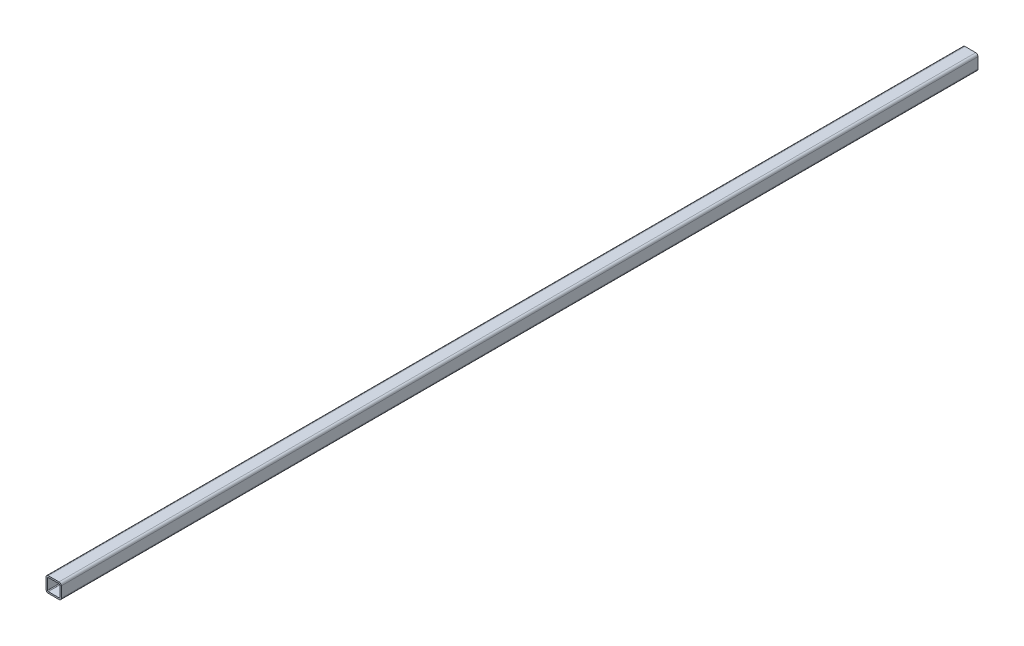
ISO-10303-21;
HEADER;
FILE_DESCRIPTION(('STEP AP214'),'2;1');
FILE_NAME('part.step','',(''),(''),'','','');
FILE_SCHEMA(('AUTOMOTIVE_DESIGN { 1 0 10303 214 1 1 1 1 }'));
ENDSEC;
DATA;
#1=APPLICATION_CONTEXT('core data for automotive mechanical design processes');
#2=APPLICATION_PROTOCOL_DEFINITION('international standard','automotive_design',2000,#1);
#3=PRODUCT_CONTEXT('',#1,'mechanical');
#4=PRODUCT('Part','Part','',(#3));
#5=PRODUCT_RELATED_PRODUCT_CATEGORY('part','',(#4));
#6=PRODUCT_DEFINITION_FORMATION('','',#4);
#7=PRODUCT_DEFINITION_CONTEXT('part definition',#1,'design');
#8=PRODUCT_DEFINITION('design','',#6,#7);
#9=PRODUCT_DEFINITION_SHAPE('','',#8);
#10=(LENGTH_UNIT() NAMED_UNIT(*) SI_UNIT(.MILLI.,.METRE.));
#11=(NAMED_UNIT(*) PLANE_ANGLE_UNIT() SI_UNIT($,.RADIAN.));
#12=(NAMED_UNIT(*) SI_UNIT($,.STERADIAN.) SOLID_ANGLE_UNIT());
#13=UNCERTAINTY_MEASURE_WITH_UNIT(LENGTH_MEASURE(1.E-05),#10,'distance_accuracy_value','');
#14=(GEOMETRIC_REPRESENTATION_CONTEXT(3) GLOBAL_UNCERTAINTY_ASSIGNED_CONTEXT((#13)) GLOBAL_UNIT_ASSIGNED_CONTEXT((#10,
#11,#12)) REPRESENTATION_CONTEXT('',''));
#15=CARTESIAN_POINT('',(0.,0.,0.));
#16=DIRECTION('',(0.,0.,1.));
#17=DIRECTION('',(1.,0.,0.));
#18=AXIS2_PLACEMENT_3D('',#15,#16,#17);
#19=CARTESIAN_POINT('',(12.75,-2.25000000000001,450.));
#20=DIRECTION('',(0.,0.,-1.));
#21=DIRECTION('',(-1.,0.,0.));
#22=AXIS2_PLACEMENT_3D('',#19,#20,#21);
#23=PLANE('',#22);
#24=CARTESIAN_POINT('',(12.75,-2.25000000000001,450.));
#25=DIRECTION('',(0.,0.,1.));
#26=DIRECTION('',(-1.,0.,0.));
#27=AXIS2_PLACEMENT_3D('',#24,#25,#26);
#28=CIRCLE('',#27,2.25);
#29=CARTESIAN_POINT('',(15.,-2.25000000000001,450.));
#30=VERTEX_POINT('',#29);
#31=CARTESIAN_POINT('',(12.75,0.,450.));
#32=VERTEX_POINT('',#31);
#33=EDGE_CURVE('E213',#30,#32,#28,.T.);
#34=ORIENTED_EDGE('',*,*,#33,.T.);
#35=DIRECTION('',(-1.,0.,0.));
#36=VECTOR('',#35,1.);
#37=CARTESIAN_POINT('',(2.24999999999996,0.,450.));
#38=LINE('',#37,#36);
#39=CARTESIAN_POINT('',(2.24999999999996,0.,450.));
#40=VERTEX_POINT('',#39);
#41=EDGE_CURVE('E216',#32,#40,#38,.T.);
#42=ORIENTED_EDGE('',*,*,#41,.T.);
#43=CARTESIAN_POINT('',(2.24999999999996,-2.25000000000001,450.));
#44=DIRECTION('',(0.,0.,1.));
#45=DIRECTION('',(-1.,0.,0.));
#46=AXIS2_PLACEMENT_3D('',#43,#44,#45);
#47=CIRCLE('',#46,2.25);
#48=CARTESIAN_POINT('',(0.,-2.25000000000001,450.));
#49=VERTEX_POINT('',#48);
#50=EDGE_CURVE('E219',#40,#49,#47,.T.);
#51=ORIENTED_EDGE('',*,*,#50,.T.);
#52=DIRECTION('',(0.,-1.,0.));
#53=VECTOR('',#52,1.);
#54=CARTESIAN_POINT('',(0.,-12.75,450.));
#55=LINE('',#54,#53);
#56=CARTESIAN_POINT('',(0.,-12.75,450.));
#57=VERTEX_POINT('',#56);
#58=EDGE_CURVE('E221',#49,#57,#55,.T.);
#59=ORIENTED_EDGE('',*,*,#58,.T.);
#60=CARTESIAN_POINT('',(2.24999999999996,-12.75,450.));
#61=DIRECTION('',(0.,0.,1.));
#62=DIRECTION('',(-1.,0.,0.));
#63=AXIS2_PLACEMENT_3D('',#60,#61,#62);
#64=CIRCLE('',#63,2.25);
#65=CARTESIAN_POINT('',(2.24999999999996,-15.,450.));
#66=VERTEX_POINT('',#65);
#67=EDGE_CURVE('E223',#57,#66,#64,.T.);
#68=ORIENTED_EDGE('',*,*,#67,.T.);
#69=DIRECTION('',(1.,0.,0.));
#70=VECTOR('',#69,1.);
#71=CARTESIAN_POINT('',(2.24999999999996,-15.,450.));
#72=LINE('',#71,#70);
#73=CARTESIAN_POINT('',(12.75,-15.,450.));
#74=VERTEX_POINT('',#73);
#75=EDGE_CURVE('E225',#66,#74,#72,.T.);
#76=ORIENTED_EDGE('',*,*,#75,.T.);
#77=CARTESIAN_POINT('',(12.75,-12.75,450.));
#78=DIRECTION('',(0.,0.,1.));
#79=DIRECTION('',(1.,0.,0.));
#80=AXIS2_PLACEMENT_3D('',#77,#78,#79);
#81=CIRCLE('',#80,2.25);
#82=CARTESIAN_POINT('',(15.,-12.75,450.));
#83=VERTEX_POINT('',#82);
#84=EDGE_CURVE('E227',#74,#83,#81,.T.);
#85=ORIENTED_EDGE('',*,*,#84,.T.);
#86=DIRECTION('',(0.,1.,0.));
#87=VECTOR('',#86,1.);
#88=CARTESIAN_POINT('',(15.,-12.75,450.));
#89=LINE('',#88,#87);
#90=EDGE_CURVE('E229',#83,#30,#89,.T.);
#91=ORIENTED_EDGE('',*,*,#90,.T.);
#92=EDGE_LOOP('',(#34,#42,#51,#59,#68,#76,#85,#91));
#93=FACE_BOUND('',#92,.T.);
#94=CARTESIAN_POINT('',(2.24999999999996,-12.75,450.));
#95=DIRECTION('',(0.,0.,1.));
#96=DIRECTION('',(-1.,0.,0.));
#97=AXIS2_PLACEMENT_3D('',#94,#95,#96);
#98=CIRCLE('',#97,0.75);
#99=CARTESIAN_POINT('',(1.49999999999996,-12.75,450.));
#100=VERTEX_POINT('',#99);
#101=CARTESIAN_POINT('',(2.24999999999996,-13.5,450.));
#102=VERTEX_POINT('',#101);
#103=EDGE_CURVE('E148',#100,#102,#98,.T.);
#104=ORIENTED_EDGE('',*,*,#103,.F.);
#105=DIRECTION('',(0.,-1.,0.));
#106=VECTOR('',#105,1.);
#107=CARTESIAN_POINT('',(1.49999999999996,-12.75,450.));
#108=LINE('',#107,#106);
#109=CARTESIAN_POINT('',(1.49999999999996,-2.25000000000002,450.));
#110=VERTEX_POINT('',#109);
#111=EDGE_CURVE('E181',#110,#100,#108,.T.);
#112=ORIENTED_EDGE('',*,*,#111,.F.);
#113=CARTESIAN_POINT('',(2.24999999999996,-2.25000000000002,450.));
#114=DIRECTION('',(0.,0.,1.));
#115=DIRECTION('',(-1.,0.,0.));
#116=AXIS2_PLACEMENT_3D('',#113,#114,#115);
#117=CIRCLE('',#116,0.749999999999999);
#118=CARTESIAN_POINT('',(2.24999999999996,-1.50000000000002,450.));
#119=VERTEX_POINT('',#118);
#120=EDGE_CURVE('E179',#119,#110,#117,.T.);
#121=ORIENTED_EDGE('',*,*,#120,.F.);
#122=DIRECTION('',(-1.,0.,0.));
#123=VECTOR('',#122,1.);
#124=CARTESIAN_POINT('',(2.24999999999996,-1.50000000000002,450.));
#125=LINE('',#124,#123);
#126=CARTESIAN_POINT('',(12.75,-1.50000000000002,450.));
#127=VERTEX_POINT('',#126);
#128=EDGE_CURVE('E177',#127,#119,#125,.T.);
#129=ORIENTED_EDGE('',*,*,#128,.F.);
#130=CARTESIAN_POINT('',(12.75,-2.25000000000002,450.));
#131=DIRECTION('',(0.,0.,1.));
#132=DIRECTION('',(-1.,0.,0.));
#133=AXIS2_PLACEMENT_3D('',#130,#131,#132);
#134=CIRCLE('',#133,0.749999999999999);
#135=CARTESIAN_POINT('',(13.5,-2.25000000000002,450.));
#136=VERTEX_POINT('',#135);
#137=EDGE_CURVE('E175',#136,#127,#134,.T.);
#138=ORIENTED_EDGE('',*,*,#137,.F.);
#139=DIRECTION('',(0.,1.,0.));
#140=VECTOR('',#139,1.);
#141=CARTESIAN_POINT('',(13.5,-12.75,450.));
#142=LINE('',#141,#140);
#143=CARTESIAN_POINT('',(13.5,-12.75,450.));
#144=VERTEX_POINT('',#143);
#145=EDGE_CURVE('E171',#144,#136,#142,.T.);
#146=ORIENTED_EDGE('',*,*,#145,.F.);
#147=CARTESIAN_POINT('',(12.75,-12.75,450.));
#148=DIRECTION('',(0.,0.,1.));
#149=DIRECTION('',(1.,0.,0.));
#150=AXIS2_PLACEMENT_3D('',#147,#148,#149);
#151=CIRCLE('',#150,0.75);
#152=CARTESIAN_POINT('',(12.75,-13.5,450.));
#153=VERTEX_POINT('',#152);
#154=EDGE_CURVE('E169',#153,#144,#151,.T.);
#155=ORIENTED_EDGE('',*,*,#154,.F.);
#156=DIRECTION('',(1.,0.,0.));
#157=VECTOR('',#156,1.);
#158=CARTESIAN_POINT('',(2.24999999999996,-13.5,450.));
#159=LINE('',#158,#157);
#160=EDGE_CURVE('E156',#102,#153,#159,.T.);
#161=ORIENTED_EDGE('',*,*,#160,.F.);
#162=EDGE_LOOP('',(#104,#112,#121,#129,#138,#146,#155,#161));
#163=FACE_BOUND('',#162,.T.);
#164=ADVANCED_FACE('F35',(#93,#163),#23,.F.);
#165=CARTESIAN_POINT('',(12.75,-2.25000000000001,-450.));
#166=DIRECTION('',(0.,0.,-1.));
#167=DIRECTION('',(-1.,0.,0.));
#168=AXIS2_PLACEMENT_3D('',#165,#166,#167);
#169=PLANE('',#168);
#170=CARTESIAN_POINT('',(12.75,-2.25000000000001,-450.));
#171=DIRECTION('',(0.,0.,1.));
#172=DIRECTION('',(-1.,0.,0.));
#173=AXIS2_PLACEMENT_3D('',#170,#171,#172);
#174=CIRCLE('',#173,2.25);
#175=CARTESIAN_POINT('',(15.,-2.25000000000001,-450.));
#176=VERTEX_POINT('',#175);
#177=CARTESIAN_POINT('',(12.75,0.,-450.));
#178=VERTEX_POINT('',#177);
#179=EDGE_CURVE('E164',#176,#178,#174,.T.);
#180=ORIENTED_EDGE('',*,*,#179,.F.);
#181=DIRECTION('',(0.,1.,0.));
#182=VECTOR('',#181,1.);
#183=CARTESIAN_POINT('',(15.,-12.75,-450.));
#184=LINE('',#183,#182);
#185=CARTESIAN_POINT('',(15.,-12.75,-450.));
#186=VERTEX_POINT('',#185);
#187=EDGE_CURVE('E217',#186,#176,#184,.T.);
#188=ORIENTED_EDGE('',*,*,#187,.F.);
#189=CARTESIAN_POINT('',(12.75,-12.75,-450.));
#190=DIRECTION('',(0.,0.,1.));
#191=DIRECTION('',(1.,0.,0.));
#192=AXIS2_PLACEMENT_3D('',#189,#190,#191);
#193=CIRCLE('',#192,2.25);
#194=CARTESIAN_POINT('',(12.75,-15.,-450.));
#195=VERTEX_POINT('',#194);
#196=EDGE_CURVE('E244',#195,#186,#193,.T.);
#197=ORIENTED_EDGE('',*,*,#196,.F.);
#198=DIRECTION('',(1.,0.,0.));
#199=VECTOR('',#198,1.);
#200=CARTESIAN_POINT('',(2.24999999999996,-15.,-450.));
#201=LINE('',#200,#199);
#202=CARTESIAN_POINT('',(2.24999999999996,-15.,-450.));
#203=VERTEX_POINT('',#202);
#204=EDGE_CURVE('E242',#203,#195,#201,.T.);
#205=ORIENTED_EDGE('',*,*,#204,.F.);
#206=CARTESIAN_POINT('',(2.24999999999996,-12.75,-450.));
#207=DIRECTION('',(0.,0.,1.));
#208=DIRECTION('',(-1.,0.,0.));
#209=AXIS2_PLACEMENT_3D('',#206,#207,#208);
#210=CIRCLE('',#209,2.25);
#211=CARTESIAN_POINT('',(0.,-12.75,-450.));
#212=VERTEX_POINT('',#211);
#213=EDGE_CURVE('E240',#212,#203,#210,.T.);
#214=ORIENTED_EDGE('',*,*,#213,.F.);
#215=DIRECTION('',(0.,-1.,0.));
#216=VECTOR('',#215,1.);
#217=CARTESIAN_POINT('',(0.,-12.75,-450.));
#218=LINE('',#217,#216);
#219=CARTESIAN_POINT('',(0.,-2.25000000000001,-450.));
#220=VERTEX_POINT('',#219);
#221=EDGE_CURVE('E238',#220,#212,#218,.T.);
#222=ORIENTED_EDGE('',*,*,#221,.F.);
#223=CARTESIAN_POINT('',(2.24999999999996,-2.25000000000001,-450.));
#224=DIRECTION('',(0.,0.,1.));
#225=DIRECTION('',(-1.,0.,0.));
#226=AXIS2_PLACEMENT_3D('',#223,#224,#225);
#227=CIRCLE('',#226,2.25);
#228=CARTESIAN_POINT('',(2.24999999999996,0.,-450.));
#229=VERTEX_POINT('',#228);
#230=EDGE_CURVE('E236',#229,#220,#227,.T.);
#231=ORIENTED_EDGE('',*,*,#230,.F.);
#232=DIRECTION('',(-1.,0.,0.));
#233=VECTOR('',#232,1.);
#234=CARTESIAN_POINT('',(2.24999999999996,0.,-450.));
#235=LINE('',#234,#233);
#236=EDGE_CURVE('E234',#178,#229,#235,.T.);
#237=ORIENTED_EDGE('',*,*,#236,.F.);
#238=EDGE_LOOP('',(#180,#188,#197,#205,#214,#222,#231,#237));
#239=FACE_BOUND('',#238,.T.);
#240=DIRECTION('',(0.,-1.,0.));
#241=VECTOR('',#240,1.);
#242=CARTESIAN_POINT('',(1.49999999999996,-12.75,-450.));
#243=LINE('',#242,#241);
#244=CARTESIAN_POINT('',(1.49999999999996,-2.25000000000002,-450.));
#245=VERTEX_POINT('',#244);
#246=CARTESIAN_POINT('',(1.49999999999996,-12.75,-450.));
#247=VERTEX_POINT('',#246);
#248=EDGE_CURVE('E157',#245,#247,#243,.T.);
#249=ORIENTED_EDGE('',*,*,#248,.T.);
#250=CARTESIAN_POINT('',(2.24999999999996,-12.75,-450.));
#251=DIRECTION('',(0.,0.,1.));
#252=DIRECTION('',(-1.,0.,0.));
#253=AXIS2_PLACEMENT_3D('',#250,#251,#252);
#254=CIRCLE('',#253,0.75);
#255=CARTESIAN_POINT('',(2.24999999999996,-13.5,-450.));
#256=VERTEX_POINT('',#255);
#257=EDGE_CURVE('E58',#247,#256,#254,.T.);
#258=ORIENTED_EDGE('',*,*,#257,.T.);
#259=DIRECTION('',(1.,0.,0.));
#260=VECTOR('',#259,1.);
#261=CARTESIAN_POINT('',(2.24999999999996,-13.5,-450.));
#262=LINE('',#261,#260);
#263=CARTESIAN_POINT('',(12.75,-13.5,-450.));
#264=VERTEX_POINT('',#263);
#265=EDGE_CURVE('E163',#256,#264,#262,.T.);
#266=ORIENTED_EDGE('',*,*,#265,.T.);
#267=CARTESIAN_POINT('',(12.75,-12.75,-450.));
#268=DIRECTION('',(0.,0.,1.));
#269=DIRECTION('',(1.,0.,0.));
#270=AXIS2_PLACEMENT_3D('',#267,#268,#269);
#271=CIRCLE('',#270,0.75);
#272=CARTESIAN_POINT('',(13.5,-12.75,-450.));
#273=VERTEX_POINT('',#272);
#274=EDGE_CURVE('E185',#264,#273,#271,.T.);
#275=ORIENTED_EDGE('',*,*,#274,.T.);
#276=DIRECTION('',(0.,1.,0.));
#277=VECTOR('',#276,1.);
#278=CARTESIAN_POINT('',(13.5,-12.75,-450.));
#279=LINE('',#278,#277);
#280=CARTESIAN_POINT('',(13.5,-2.25000000000002,-450.));
#281=VERTEX_POINT('',#280);
#282=EDGE_CURVE('E188',#273,#281,#279,.T.);
#283=ORIENTED_EDGE('',*,*,#282,.T.);
#284=CARTESIAN_POINT('',(12.75,-2.25000000000002,-450.));
#285=DIRECTION('',(0.,0.,1.));
#286=DIRECTION('',(-1.,0.,0.));
#287=AXIS2_PLACEMENT_3D('',#284,#285,#286);
#288=CIRCLE('',#287,0.749999999999999);
#289=CARTESIAN_POINT('',(12.75,-1.50000000000002,-450.));
#290=VERTEX_POINT('',#289);
#291=EDGE_CURVE('E191',#281,#290,#288,.T.);
#292=ORIENTED_EDGE('',*,*,#291,.T.);
#293=DIRECTION('',(-1.,0.,0.));
#294=VECTOR('',#293,1.);
#295=CARTESIAN_POINT('',(2.24999999999996,-1.50000000000002,-450.));
#296=LINE('',#295,#294);
#297=CARTESIAN_POINT('',(2.24999999999996,-1.50000000000002,-450.));
#298=VERTEX_POINT('',#297);
#299=EDGE_CURVE('E194',#290,#298,#296,.T.);
#300=ORIENTED_EDGE('',*,*,#299,.T.);
#301=CARTESIAN_POINT('',(2.24999999999996,-2.25000000000002,-450.));
#302=DIRECTION('',(0.,0.,1.));
#303=DIRECTION('',(-1.,0.,0.));
#304=AXIS2_PLACEMENT_3D('',#301,#302,#303);
#305=CIRCLE('',#304,0.749999999999999);
#306=EDGE_CURVE('E197',#298,#245,#305,.T.);
#307=ORIENTED_EDGE('',*,*,#306,.T.);
#308=EDGE_LOOP('',(#249,#258,#266,#275,#283,#292,#300,#307));
#309=FACE_BOUND('',#308,.T.);
#310=ADVANCED_FACE('F274',(#239,#309),#169,.T.);
#311=CARTESIAN_POINT('',(12.75,-2.25000000000001,450.));
#312=DIRECTION('',(0.,0.,-1.));
#313=DIRECTION('',(-1.,0.,0.));
#314=AXIS2_PLACEMENT_3D('',#311,#312,#313);
#315=CYLINDRICAL_SURFACE('',#314,2.25);
#316=ORIENTED_EDGE('',*,*,#179,.T.);
#317=DIRECTION('',(0.,0.,-1.));
#318=VECTOR('',#317,1.);
#319=CARTESIAN_POINT('',(12.75,0.,450.));
#320=LINE('',#319,#318);
#321=EDGE_CURVE('E11',#32,#178,#320,.T.);
#322=ORIENTED_EDGE('',*,*,#321,.F.);
#323=ORIENTED_EDGE('',*,*,#33,.F.);
#324=DIRECTION('',(0.,0.,-1.));
#325=VECTOR('',#324,1.);
#326=CARTESIAN_POINT('',(15.,-2.25000000000001,450.));
#327=LINE('',#326,#325);
#328=EDGE_CURVE('E231',#30,#176,#327,.T.);
#329=ORIENTED_EDGE('',*,*,#328,.T.);
#330=EDGE_LOOP('',(#316,#322,#323,#329));
#331=FACE_BOUND('',#330,.T.);
#332=ADVANCED_FACE('F37',(#331),#315,.T.);
#333=CARTESIAN_POINT('',(2.24999999999996,0.,450.));
#334=DIRECTION('',(0.,-1.,0.));
#335=DIRECTION('',(0.,0.,-1.));
#336=AXIS2_PLACEMENT_3D('',#333,#334,#335);
#337=PLANE('',#336);
#338=ORIENTED_EDGE('',*,*,#236,.T.);
#339=DIRECTION('',(0.,0.,-1.));
#340=VECTOR('',#339,1.);
#341=CARTESIAN_POINT('',(2.24999999999996,0.,450.));
#342=LINE('',#341,#340);
#343=EDGE_CURVE('E43',#40,#229,#342,.T.);
#344=ORIENTED_EDGE('',*,*,#343,.F.);
#345=ORIENTED_EDGE('',*,*,#41,.F.);
#346=ORIENTED_EDGE('',*,*,#321,.T.);
#347=EDGE_LOOP('',(#338,#344,#345,#346));
#348=FACE_BOUND('',#347,.T.);
#349=ADVANCED_FACE('F291',(#348),#337,.F.);
#350=CARTESIAN_POINT('',(2.24999999999996,-2.25000000000001,450.));
#351=DIRECTION('',(0.,0.,-1.));
#352=DIRECTION('',(-1.,0.,0.));
#353=AXIS2_PLACEMENT_3D('',#350,#351,#352);
#354=CYLINDRICAL_SURFACE('',#353,2.25);
#355=ORIENTED_EDGE('',*,*,#230,.T.);
#356=DIRECTION('',(0.,0.,-1.));
#357=VECTOR('',#356,1.);
#358=CARTESIAN_POINT('',(0.,-2.25000000000001,450.));
#359=LINE('',#358,#357);
#360=EDGE_CURVE('E261',#49,#220,#359,.T.);
#361=ORIENTED_EDGE('',*,*,#360,.F.);
#362=ORIENTED_EDGE('',*,*,#50,.F.);
#363=ORIENTED_EDGE('',*,*,#343,.T.);
#364=EDGE_LOOP('',(#355,#361,#362,#363));
#365=FACE_BOUND('',#364,.T.);
#366=ADVANCED_FACE('F268',(#365),#354,.T.);
#367=CARTESIAN_POINT('',(0.,-12.75,450.));
#368=DIRECTION('',(1.,0.,0.));
#369=DIRECTION('',(0.,0.,-1.));
#370=AXIS2_PLACEMENT_3D('',#367,#368,#369);
#371=PLANE('',#370);
#372=ORIENTED_EDGE('',*,*,#221,.T.);
#373=DIRECTION('',(0.,0.,-1.));
#374=VECTOR('',#373,1.);
#375=CARTESIAN_POINT('',(0.,-12.75,450.));
#376=LINE('',#375,#374);
#377=EDGE_CURVE('E258',#57,#212,#376,.T.);
#378=ORIENTED_EDGE('',*,*,#377,.F.);
#379=ORIENTED_EDGE('',*,*,#58,.F.);
#380=ORIENTED_EDGE('',*,*,#360,.T.);
#381=EDGE_LOOP('',(#372,#378,#379,#380));
#382=FACE_BOUND('',#381,.T.);
#383=ADVANCED_FACE('F280',(#382),#371,.F.);
#384=CARTESIAN_POINT('',(2.24999999999996,-12.75,450.));
#385=DIRECTION('',(0.,0.,-1.));
#386=DIRECTION('',(-1.,0.,0.));
#387=AXIS2_PLACEMENT_3D('',#384,#385,#386);
#388=CYLINDRICAL_SURFACE('',#387,2.25);
#389=ORIENTED_EDGE('',*,*,#213,.T.);
#390=DIRECTION('',(0.,0.,-1.));
#391=VECTOR('',#390,1.);
#392=CARTESIAN_POINT('',(2.24999999999996,-15.,450.));
#393=LINE('',#392,#391);
#394=EDGE_CURVE('E255',#66,#203,#393,.T.);
#395=ORIENTED_EDGE('',*,*,#394,.F.);
#396=ORIENTED_EDGE('',*,*,#67,.F.);
#397=ORIENTED_EDGE('',*,*,#377,.T.);
#398=EDGE_LOOP('',(#389,#395,#396,#397));
#399=FACE_BOUND('',#398,.T.);
#400=ADVANCED_FACE('F284',(#399),#388,.T.);
#401=CARTESIAN_POINT('',(2.24999999999996,-15.,450.));
#402=DIRECTION('',(0.,1.,0.));
#403=DIRECTION('',(0.,0.,1.));
#404=AXIS2_PLACEMENT_3D('',#401,#402,#403);
#405=PLANE('',#404);
#406=ORIENTED_EDGE('',*,*,#204,.T.);
#407=DIRECTION('',(0.,0.,-1.));
#408=VECTOR('',#407,1.);
#409=CARTESIAN_POINT('',(12.75,-15.,450.));
#410=LINE('',#409,#408);
#411=EDGE_CURVE('E252',#74,#195,#410,.T.);
#412=ORIENTED_EDGE('',*,*,#411,.F.);
#413=ORIENTED_EDGE('',*,*,#75,.F.);
#414=ORIENTED_EDGE('',*,*,#394,.T.);
#415=EDGE_LOOP('',(#406,#412,#413,#414));
#416=FACE_BOUND('',#415,.T.);
#417=ADVANCED_FACE('F304',(#416),#405,.F.);
#418=CARTESIAN_POINT('',(12.75,-12.75,450.));
#419=DIRECTION('',(0.,0.,-1.));
#420=DIRECTION('',(-1.,0.,0.));
#421=AXIS2_PLACEMENT_3D('',#418,#419,#420);
#422=CYLINDRICAL_SURFACE('',#421,2.25);
#423=ORIENTED_EDGE('',*,*,#196,.T.);
#424=DIRECTION('',(0.,0.,-1.));
#425=VECTOR('',#424,1.);
#426=CARTESIAN_POINT('',(15.,-12.75,450.));
#427=LINE('',#426,#425);
#428=EDGE_CURVE('E249',#83,#186,#427,.T.);
#429=ORIENTED_EDGE('',*,*,#428,.F.);
#430=ORIENTED_EDGE('',*,*,#84,.F.);
#431=ORIENTED_EDGE('',*,*,#411,.T.);
#432=EDGE_LOOP('',(#423,#429,#430,#431));
#433=FACE_BOUND('',#432,.T.);
#434=ADVANCED_FACE('F302',(#433),#422,.T.);
#435=CARTESIAN_POINT('',(15.,-12.75,450.));
#436=DIRECTION('',(-1.,0.,0.));
#437=DIRECTION('',(0.,0.,1.));
#438=AXIS2_PLACEMENT_3D('',#435,#436,#437);
#439=PLANE('',#438);
#440=ORIENTED_EDGE('',*,*,#187,.T.);
#441=ORIENTED_EDGE('',*,*,#328,.F.);
#442=ORIENTED_EDGE('',*,*,#90,.F.);
#443=ORIENTED_EDGE('',*,*,#428,.T.);
#444=EDGE_LOOP('',(#440,#441,#442,#443));
#445=FACE_BOUND('',#444,.T.);
#446=ADVANCED_FACE('F297',(#445),#439,.F.);
#447=CARTESIAN_POINT('',(2.24999999999996,-12.75,450.));
#448=DIRECTION('',(0.,0.,-1.));
#449=DIRECTION('',(-1.,0.,0.));
#450=AXIS2_PLACEMENT_3D('',#447,#448,#449);
#451=CYLINDRICAL_SURFACE('',#450,0.75);
#452=ORIENTED_EDGE('',*,*,#257,.F.);
#453=DIRECTION('',(0.,0.,-1.));
#454=VECTOR('',#453,1.);
#455=CARTESIAN_POINT('',(1.49999999999996,-12.75,450.));
#456=LINE('',#455,#454);
#457=EDGE_CURVE('E152',#100,#247,#456,.T.);
#458=ORIENTED_EDGE('',*,*,#457,.F.);
#459=ORIENTED_EDGE('',*,*,#103,.T.);
#460=DIRECTION('',(0.,0.,-1.));
#461=VECTOR('',#460,1.);
#462=CARTESIAN_POINT('',(2.24999999999996,-13.5,450.));
#463=LINE('',#462,#461);
#464=EDGE_CURVE('E151',#102,#256,#463,.T.);
#465=ORIENTED_EDGE('',*,*,#464,.T.);
#466=EDGE_LOOP('',(#452,#458,#459,#465));
#467=FACE_BOUND('',#466,.T.);
#468=ADVANCED_FACE('F150',(#467),#451,.F.);
#469=CARTESIAN_POINT('',(2.24999999999996,-13.5,450.));
#470=DIRECTION('',(0.,1.,0.));
#471=DIRECTION('',(-1.,0.,0.));
#472=AXIS2_PLACEMENT_3D('',#469,#470,#471);
#473=PLANE('',#472);
#474=ORIENTED_EDGE('',*,*,#265,.F.);
#475=ORIENTED_EDGE('',*,*,#464,.F.);
#476=ORIENTED_EDGE('',*,*,#160,.T.);
#477=DIRECTION('',(0.,0.,-1.));
#478=VECTOR('',#477,1.);
#479=CARTESIAN_POINT('',(12.75,-13.5,450.));
#480=LINE('',#479,#478);
#481=EDGE_CURVE('E165',#153,#264,#480,.T.);
#482=ORIENTED_EDGE('',*,*,#481,.T.);
#483=EDGE_LOOP('',(#474,#475,#476,#482));
#484=FACE_BOUND('',#483,.T.);
#485=ADVANCED_FACE('F160',(#484),#473,.T.);
#486=CARTESIAN_POINT('',(12.75,-12.75,450.));
#487=DIRECTION('',(0.,0.,-1.));
#488=DIRECTION('',(-1.,0.,0.));
#489=AXIS2_PLACEMENT_3D('',#486,#487,#488);
#490=CYLINDRICAL_SURFACE('',#489,0.75);
#491=ORIENTED_EDGE('',*,*,#274,.F.);
#492=ORIENTED_EDGE('',*,*,#481,.F.);
#493=ORIENTED_EDGE('',*,*,#154,.T.);
#494=DIRECTION('',(0.,0.,-1.));
#495=VECTOR('',#494,1.);
#496=CARTESIAN_POINT('',(13.5,-12.75,450.));
#497=LINE('',#496,#495);
#498=EDGE_CURVE('E210',#144,#273,#497,.T.);
#499=ORIENTED_EDGE('',*,*,#498,.T.);
#500=EDGE_LOOP('',(#491,#492,#493,#499));
#501=FACE_BOUND('',#500,.T.);
#502=ADVANCED_FACE('F329',(#501),#490,.F.);
#503=CARTESIAN_POINT('',(13.5,-12.75,450.));
#504=DIRECTION('',(-1.,0.,0.));
#505=DIRECTION('',(0.,0.,1.));
#506=AXIS2_PLACEMENT_3D('',#503,#504,#505);
#507=PLANE('',#506);
#508=ORIENTED_EDGE('',*,*,#282,.F.);
#509=ORIENTED_EDGE('',*,*,#498,.F.);
#510=ORIENTED_EDGE('',*,*,#145,.T.);
#511=DIRECTION('',(0.,0.,-1.));
#512=VECTOR('',#511,1.);
#513=CARTESIAN_POINT('',(13.5,-2.25000000000002,450.));
#514=LINE('',#513,#512);
#515=EDGE_CURVE('E208',#136,#281,#514,.T.);
#516=ORIENTED_EDGE('',*,*,#515,.T.);
#517=EDGE_LOOP('',(#508,#509,#510,#516));
#518=FACE_BOUND('',#517,.T.);
#519=ADVANCED_FACE('F333',(#518),#507,.T.);
#520=CARTESIAN_POINT('',(12.75,-2.25000000000002,450.));
#521=DIRECTION('',(0.,0.,-1.));
#522=DIRECTION('',(-1.,0.,0.));
#523=AXIS2_PLACEMENT_3D('',#520,#521,#522);
#524=CYLINDRICAL_SURFACE('',#523,0.749999999999999);
#525=ORIENTED_EDGE('',*,*,#291,.F.);
#526=ORIENTED_EDGE('',*,*,#515,.F.);
#527=ORIENTED_EDGE('',*,*,#137,.T.);
#528=DIRECTION('',(0.,0.,-1.));
#529=VECTOR('',#528,1.);
#530=CARTESIAN_POINT('',(12.75,-1.50000000000002,450.));
#531=LINE('',#530,#529);
#532=EDGE_CURVE('E206',#127,#290,#531,.T.);
#533=ORIENTED_EDGE('',*,*,#532,.T.);
#534=EDGE_LOOP('',(#525,#526,#527,#533));
#535=FACE_BOUND('',#534,.T.);
#536=ADVANCED_FACE('F339',(#535),#524,.F.);
#537=CARTESIAN_POINT('',(2.24999999999996,-1.50000000000002,450.));
#538=DIRECTION('',(0.,-1.,0.));
#539=DIRECTION('',(0.,0.,-1.));
#540=AXIS2_PLACEMENT_3D('',#537,#538,#539);
#541=PLANE('',#540);
#542=ORIENTED_EDGE('',*,*,#299,.F.);
#543=ORIENTED_EDGE('',*,*,#532,.F.);
#544=ORIENTED_EDGE('',*,*,#128,.T.);
#545=DIRECTION('',(0.,0.,-1.));
#546=VECTOR('',#545,1.);
#547=CARTESIAN_POINT('',(2.24999999999996,-1.50000000000002,450.));
#548=LINE('',#547,#546);
#549=EDGE_CURVE('E204',#119,#298,#548,.T.);
#550=ORIENTED_EDGE('',*,*,#549,.T.);
#551=EDGE_LOOP('',(#542,#543,#544,#550));
#552=FACE_BOUND('',#551,.T.);
#553=ADVANCED_FACE('F343',(#552),#541,.T.);
#554=CARTESIAN_POINT('',(2.24999999999996,-2.25000000000002,450.));
#555=DIRECTION('',(0.,0.,-1.));
#556=DIRECTION('',(-1.,0.,0.));
#557=AXIS2_PLACEMENT_3D('',#554,#555,#556);
#558=CYLINDRICAL_SURFACE('',#557,0.749999999999999);
#559=ORIENTED_EDGE('',*,*,#306,.F.);
#560=ORIENTED_EDGE('',*,*,#549,.F.);
#561=ORIENTED_EDGE('',*,*,#120,.T.);
#562=DIRECTION('',(0.,0.,-1.));
#563=VECTOR('',#562,1.);
#564=CARTESIAN_POINT('',(1.49999999999996,-2.25000000000002,450.));
#565=LINE('',#564,#563);
#566=EDGE_CURVE('E50',#110,#245,#565,.T.);
#567=ORIENTED_EDGE('',*,*,#566,.T.);
#568=EDGE_LOOP('',(#559,#560,#561,#567));
#569=FACE_BOUND('',#568,.T.);
#570=ADVANCED_FACE('F347',(#569),#558,.F.);
#571=CARTESIAN_POINT('',(1.49999999999996,-12.75,450.));
#572=DIRECTION('',(1.,0.,0.));
#573=DIRECTION('',(0.,0.,-1.));
#574=AXIS2_PLACEMENT_3D('',#571,#572,#573);
#575=PLANE('',#574);
#576=ORIENTED_EDGE('',*,*,#248,.F.);
#577=ORIENTED_EDGE('',*,*,#566,.F.);
#578=ORIENTED_EDGE('',*,*,#111,.T.);
#579=ORIENTED_EDGE('',*,*,#457,.T.);
#580=EDGE_LOOP('',(#576,#577,#578,#579));
#581=FACE_BOUND('',#580,.T.);
#582=ADVANCED_FACE('F351',(#581),#575,.T.);
#583=CLOSED_SHELL('',(#164,#310,#332,#349,#366,#383,#400,#417,#434,#446,#468,#485,#502,#519,
#536,#553,#570,#582));
#584=MANIFOLD_SOLID_BREP('B2',#583);
#585=ADVANCED_BREP_SHAPE_REPRESENTATION('',(#18,#584),#14);
#586=SHAPE_DEFINITION_REPRESENTATION(#9,#585);
ENDSEC;
END-ISO-10303-21;
